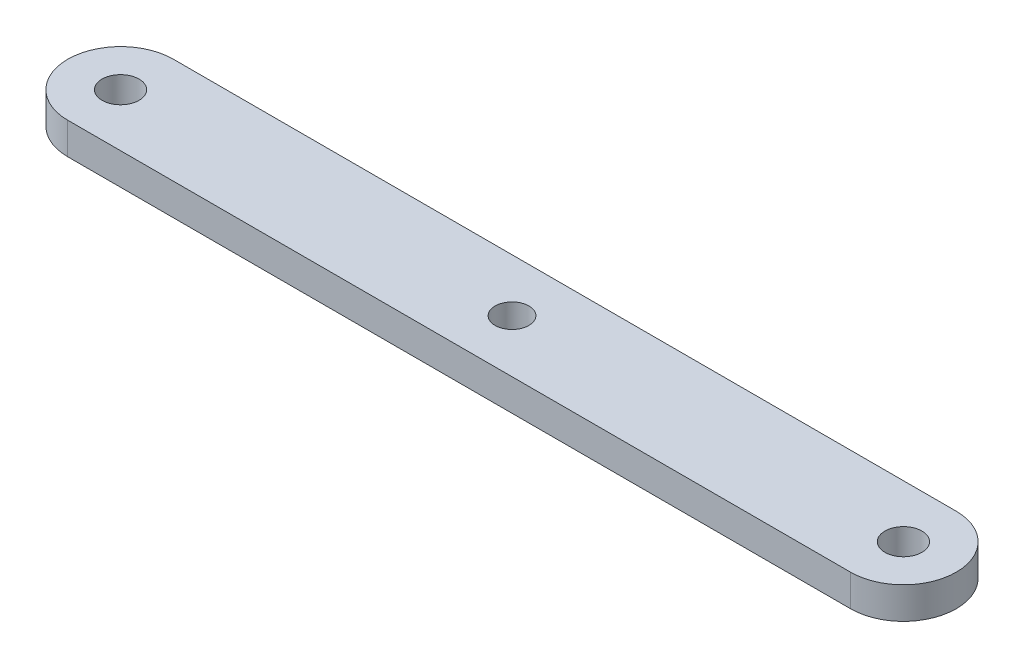
ISO-10303-21;
HEADER;
FILE_DESCRIPTION(('STEP AP214'),'2;1');
FILE_NAME('part.step','',(''),(''),'','','');
FILE_SCHEMA(('AUTOMOTIVE_DESIGN { 1 0 10303 214 1 1 1 1 }'));
ENDSEC;
DATA;
#1=APPLICATION_CONTEXT('core data for automotive mechanical design processes');
#2=APPLICATION_PROTOCOL_DEFINITION('international standard','automotive_design',2000,#1);
#3=PRODUCT_CONTEXT('',#1,'mechanical');
#4=PRODUCT('Part','Part','',(#3));
#5=PRODUCT_RELATED_PRODUCT_CATEGORY('part','',(#4));
#6=PRODUCT_DEFINITION_FORMATION('','',#4);
#7=PRODUCT_DEFINITION_CONTEXT('part definition',#1,'design');
#8=PRODUCT_DEFINITION('design','',#6,#7);
#9=PRODUCT_DEFINITION_SHAPE('','',#8);
#10=(LENGTH_UNIT() NAMED_UNIT(*) SI_UNIT(.MILLI.,.METRE.));
#11=(NAMED_UNIT(*) PLANE_ANGLE_UNIT() SI_UNIT($,.RADIAN.));
#12=(NAMED_UNIT(*) SI_UNIT($,.STERADIAN.) SOLID_ANGLE_UNIT());
#13=UNCERTAINTY_MEASURE_WITH_UNIT(LENGTH_MEASURE(1.E-05),#10,'distance_accuracy_value','');
#14=(GEOMETRIC_REPRESENTATION_CONTEXT(3) GLOBAL_UNCERTAINTY_ASSIGNED_CONTEXT((#13)) GLOBAL_UNIT_ASSIGNED_CONTEXT((#10,
#11,#12)) REPRESENTATION_CONTEXT('',''));
#15=CARTESIAN_POINT('',(0.,0.,0.));
#16=DIRECTION('',(0.,0.,1.));
#17=DIRECTION('',(1.,0.,0.));
#18=AXIS2_PLACEMENT_3D('',#15,#16,#17);
#19=CARTESIAN_POINT('',(-37.0517168291649,3.,25.));
#20=DIRECTION('',(0.,1.,0.));
#21=DIRECTION('',(0.,0.,1.));
#22=AXIS2_PLACEMENT_3D('',#19,#20,#21);
#23=PLANE('',#22);
#24=CARTESIAN_POINT('',(37.0517168291649,3.,25.));
#25=DIRECTION('',(0.,1.,0.));
#26=DIRECTION('',(0.,0.,1.));
#27=AXIS2_PLACEMENT_3D('',#24,#25,#26);
#28=CIRCLE('',#27,1.75);
#29=CARTESIAN_POINT('',(37.0517168291649,3.,26.75));
#30=VERTEX_POINT('',#29);
#31=EDGE_CURVE('E119',#30,#30,#28,.T.);
#32=ORIENTED_EDGE('',*,*,#31,.F.);
#33=EDGE_LOOP('',(#32));
#34=FACE_BOUND('',#33,.T.);
#35=CARTESIAN_POINT('',(-37.0517168291649,3.,25.));
#36=DIRECTION('',(0.,1.,0.));
#37=DIRECTION('',(0.,0.,1.));
#38=AXIS2_PLACEMENT_3D('',#35,#36,#37);
#39=CIRCLE('',#38,5.00000000000003);
#40=CARTESIAN_POINT('',(-37.0517168291649,3.,20.));
#41=VERTEX_POINT('',#40);
#42=CARTESIAN_POINT('',(-37.0517168291649,3.,30.));
#43=VERTEX_POINT('',#42);
#44=EDGE_CURVE('E89',#41,#43,#39,.T.);
#45=ORIENTED_EDGE('',*,*,#44,.T.);
#46=DIRECTION('',(1.,0.,0.));
#47=VECTOR('',#46,1.);
#48=CARTESIAN_POINT('',(-37.0517168291649,3.,30.));
#49=LINE('',#48,#47);
#50=CARTESIAN_POINT('',(37.0517168291649,3.,30.));
#51=VERTEX_POINT('',#50);
#52=EDGE_CURVE('E84',#43,#51,#49,.T.);
#53=ORIENTED_EDGE('',*,*,#52,.T.);
#54=CARTESIAN_POINT('',(37.0517168291649,3.,25.));
#55=DIRECTION('',(0.,1.,0.));
#56=DIRECTION('',(0.,0.,1.));
#57=AXIS2_PLACEMENT_3D('',#54,#55,#56);
#58=CIRCLE('',#57,5.00000000000003);
#59=CARTESIAN_POINT('',(37.0517168291649,3.,20.));
#60=VERTEX_POINT('',#59);
#61=EDGE_CURVE('E87',#51,#60,#58,.T.);
#62=ORIENTED_EDGE('',*,*,#61,.T.);
#63=DIRECTION('',(-1.,0.,0.));
#64=VECTOR('',#63,1.);
#65=CARTESIAN_POINT('',(-37.0517168291649,3.,20.));
#66=LINE('',#65,#64);
#67=EDGE_CURVE('E54',#60,#41,#66,.T.);
#68=ORIENTED_EDGE('',*,*,#67,.T.);
#69=EDGE_LOOP('',(#45,#53,#62,#68));
#70=FACE_BOUND('',#69,.T.);
#71=CARTESIAN_POINT('',(0.,3.,25.));
#72=DIRECTION('',(0.,1.,0.));
#73=DIRECTION('',(0.,0.,1.));
#74=AXIS2_PLACEMENT_3D('',#71,#72,#73);
#75=CIRCLE('',#74,1.6);
#76=CARTESIAN_POINT('',(0.,3.,26.6));
#77=VERTEX_POINT('',#76);
#78=EDGE_CURVE('E104',#77,#77,#75,.T.);
#79=ORIENTED_EDGE('',*,*,#78,.F.);
#80=EDGE_LOOP('',(#79));
#81=FACE_BOUND('',#80,.T.);
#82=CARTESIAN_POINT('',(-37.0517168291649,3.,25.));
#83=DIRECTION('',(0.,1.,0.));
#84=DIRECTION('',(0.,0.,-1.));
#85=AXIS2_PLACEMENT_3D('',#82,#83,#84);
#86=CIRCLE('',#85,1.75);
#87=CARTESIAN_POINT('',(-37.0517168291649,3.,23.25));
#88=VERTEX_POINT('',#87);
#89=EDGE_CURVE('E125',#88,#88,#86,.T.);
#90=ORIENTED_EDGE('',*,*,#89,.F.);
#91=EDGE_LOOP('',(#90));
#92=FACE_BOUND('',#91,.T.);
#93=ADVANCED_FACE('F37',(#34,#70,#81,#92),#23,.T.);
#94=CARTESIAN_POINT('',(-37.0517168291649,0.,25.));
#95=DIRECTION('',(0.,1.,0.));
#96=DIRECTION('',(0.,0.,1.));
#97=AXIS2_PLACEMENT_3D('',#94,#95,#96);
#98=PLANE('',#97);
#99=CARTESIAN_POINT('',(-37.0517168291649,0.,25.));
#100=DIRECTION('',(0.,1.,0.));
#101=DIRECTION('',(0.,0.,1.));
#102=AXIS2_PLACEMENT_3D('',#99,#100,#101);
#103=CIRCLE('',#102,5.00000000000003);
#104=CARTESIAN_POINT('',(-37.0517168291649,0.,20.));
#105=VERTEX_POINT('',#104);
#106=CARTESIAN_POINT('',(-37.0517168291649,0.,30.));
#107=VERTEX_POINT('',#106);
#108=EDGE_CURVE('E101',#105,#107,#103,.T.);
#109=ORIENTED_EDGE('',*,*,#108,.F.);
#110=DIRECTION('',(-1.,0.,0.));
#111=VECTOR('',#110,1.);
#112=CARTESIAN_POINT('',(-37.0517168291649,0.,20.));
#113=LINE('',#112,#111);
#114=CARTESIAN_POINT('',(37.0517168291649,0.,20.));
#115=VERTEX_POINT('',#114);
#116=EDGE_CURVE('E77',#115,#105,#113,.T.);
#117=ORIENTED_EDGE('',*,*,#116,.F.);
#118=CARTESIAN_POINT('',(37.0517168291649,0.,25.));
#119=DIRECTION('',(0.,1.,0.));
#120=DIRECTION('',(0.,0.,1.));
#121=AXIS2_PLACEMENT_3D('',#118,#119,#120);
#122=CIRCLE('',#121,5.00000000000003);
#123=CARTESIAN_POINT('',(37.0517168291649,0.,30.));
#124=VERTEX_POINT('',#123);
#125=EDGE_CURVE('E71',#124,#115,#122,.T.);
#126=ORIENTED_EDGE('',*,*,#125,.F.);
#127=DIRECTION('',(1.,0.,0.));
#128=VECTOR('',#127,1.);
#129=CARTESIAN_POINT('',(-37.0517168291649,0.,30.));
#130=LINE('',#129,#128);
#131=EDGE_CURVE('E93',#107,#124,#130,.T.);
#132=ORIENTED_EDGE('',*,*,#131,.F.);
#133=EDGE_LOOP('',(#109,#117,#126,#132));
#134=FACE_BOUND('',#133,.T.);
#135=CARTESIAN_POINT('',(0.,0.,25.));
#136=DIRECTION('',(0.,1.,0.));
#137=DIRECTION('',(0.,0.,1.));
#138=AXIS2_PLACEMENT_3D('',#135,#136,#137);
#139=CIRCLE('',#138,1.6);
#140=CARTESIAN_POINT('',(0.,0.,26.6));
#141=VERTEX_POINT('',#140);
#142=EDGE_CURVE('E116',#141,#141,#139,.T.);
#143=ORIENTED_EDGE('',*,*,#142,.T.);
#144=EDGE_LOOP('',(#143));
#145=FACE_BOUND('',#144,.T.);
#146=CARTESIAN_POINT('',(37.0517168291649,0.,25.));
#147=DIRECTION('',(0.,1.,0.));
#148=DIRECTION('',(0.,0.,1.));
#149=AXIS2_PLACEMENT_3D('',#146,#147,#148);
#150=CIRCLE('',#149,1.75);
#151=CARTESIAN_POINT('',(37.0517168291649,0.,26.75));
#152=VERTEX_POINT('',#151);
#153=EDGE_CURVE('E122',#152,#152,#150,.T.);
#154=ORIENTED_EDGE('',*,*,#153,.T.);
#155=EDGE_LOOP('',(#154));
#156=FACE_BOUND('',#155,.T.);
#157=CARTESIAN_POINT('',(-37.0517168291649,0.,25.));
#158=DIRECTION('',(0.,1.,0.));
#159=DIRECTION('',(0.,0.,-1.));
#160=AXIS2_PLACEMENT_3D('',#157,#158,#159);
#161=CIRCLE('',#160,1.75);
#162=CARTESIAN_POINT('',(-37.0517168291649,0.,23.25));
#163=VERTEX_POINT('',#162);
#164=EDGE_CURVE('E128',#163,#163,#161,.T.);
#165=ORIENTED_EDGE('',*,*,#164,.T.);
#166=EDGE_LOOP('',(#165));
#167=FACE_BOUND('',#166,.T.);
#168=ADVANCED_FACE('F112',(#134,#145,#156,#167),#98,.F.);
#169=CARTESIAN_POINT('',(-37.0517168291649,3.,25.));
#170=DIRECTION('',(0.,-1.,0.));
#171=DIRECTION('',(0.,0.,-1.));
#172=AXIS2_PLACEMENT_3D('',#169,#170,#171);
#173=CYLINDRICAL_SURFACE('',#172,5.00000000000003);
#174=ORIENTED_EDGE('',*,*,#108,.T.);
#175=DIRECTION('',(0.,-1.,0.));
#176=VECTOR('',#175,1.);
#177=CARTESIAN_POINT('',(-37.0517168291649,3.,30.));
#178=LINE('',#177,#176);
#179=EDGE_CURVE('E11',#43,#107,#178,.T.);
#180=ORIENTED_EDGE('',*,*,#179,.F.);
#181=ORIENTED_EDGE('',*,*,#44,.F.);
#182=DIRECTION('',(0.,-1.,0.));
#183=VECTOR('',#182,1.);
#184=CARTESIAN_POINT('',(-37.0517168291649,3.,20.));
#185=LINE('',#184,#183);
#186=EDGE_CURVE('E97',#41,#105,#185,.T.);
#187=ORIENTED_EDGE('',*,*,#186,.T.);
#188=EDGE_LOOP('',(#174,#180,#181,#187));
#189=FACE_BOUND('',#188,.T.);
#190=ADVANCED_FACE('F39',(#189),#173,.T.);
#191=CARTESIAN_POINT('',(-37.0517168291649,3.,30.));
#192=DIRECTION('',(0.,0.,-1.));
#193=DIRECTION('',(-1.,0.,0.));
#194=AXIS2_PLACEMENT_3D('',#191,#192,#193);
#195=PLANE('',#194);
#196=ORIENTED_EDGE('',*,*,#131,.T.);
#197=DIRECTION('',(0.,-1.,0.));
#198=VECTOR('',#197,1.);
#199=CARTESIAN_POINT('',(37.0517168291649,3.,30.));
#200=LINE('',#199,#198);
#201=EDGE_CURVE('E46',#51,#124,#200,.T.);
#202=ORIENTED_EDGE('',*,*,#201,.F.);
#203=ORIENTED_EDGE('',*,*,#52,.F.);
#204=ORIENTED_EDGE('',*,*,#179,.T.);
#205=EDGE_LOOP('',(#196,#202,#203,#204));
#206=FACE_BOUND('',#205,.T.);
#207=ADVANCED_FACE('F92',(#206),#195,.F.);
#208=CARTESIAN_POINT('',(37.0517168291649,3.,25.));
#209=DIRECTION('',(0.,-1.,0.));
#210=DIRECTION('',(0.,0.,-1.));
#211=AXIS2_PLACEMENT_3D('',#208,#209,#210);
#212=CYLINDRICAL_SURFACE('',#211,5.00000000000003);
#213=ORIENTED_EDGE('',*,*,#125,.T.);
#214=DIRECTION('',(0.,-1.,0.));
#215=VECTOR('',#214,1.);
#216=CARTESIAN_POINT('',(37.0517168291649,3.,20.));
#217=LINE('',#216,#215);
#218=EDGE_CURVE('E94',#60,#115,#217,.T.);
#219=ORIENTED_EDGE('',*,*,#218,.F.);
#220=ORIENTED_EDGE('',*,*,#61,.F.);
#221=ORIENTED_EDGE('',*,*,#201,.T.);
#222=EDGE_LOOP('',(#213,#219,#220,#221));
#223=FACE_BOUND('',#222,.T.);
#224=ADVANCED_FACE('F95',(#223),#212,.T.);
#225=CARTESIAN_POINT('',(-37.0517168291649,3.,20.));
#226=DIRECTION('',(0.,0.,1.));
#227=DIRECTION('',(1.,0.,0.));
#228=AXIS2_PLACEMENT_3D('',#225,#226,#227);
#229=PLANE('',#228);
#230=ORIENTED_EDGE('',*,*,#116,.T.);
#231=ORIENTED_EDGE('',*,*,#186,.F.);
#232=ORIENTED_EDGE('',*,*,#67,.F.);
#233=ORIENTED_EDGE('',*,*,#218,.T.);
#234=EDGE_LOOP('',(#230,#231,#232,#233));
#235=FACE_BOUND('',#234,.T.);
#236=ADVANCED_FACE('F109',(#235),#229,.F.);
#237=CARTESIAN_POINT('',(0.,3.,25.));
#238=DIRECTION('',(0.,-1.,0.));
#239=DIRECTION('',(0.,0.,-1.));
#240=AXIS2_PLACEMENT_3D('',#237,#238,#239);
#241=CYLINDRICAL_SURFACE('',#240,1.6);
#242=ORIENTED_EDGE('',*,*,#78,.T.);
#243=EDGE_LOOP('',(#242));
#244=FACE_BOUND('',#243,.T.);
#245=ORIENTED_EDGE('',*,*,#142,.F.);
#246=EDGE_LOOP('',(#245));
#247=FACE_BOUND('',#246,.T.);
#248=ADVANCED_FACE('F146',(#244,#247),#241,.F.);
#249=CARTESIAN_POINT('',(37.0517168291649,3.,25.));
#250=DIRECTION('',(0.,-1.,0.));
#251=DIRECTION('',(0.,0.,-1.));
#252=AXIS2_PLACEMENT_3D('',#249,#250,#251);
#253=CYLINDRICAL_SURFACE('',#252,1.75);
#254=ORIENTED_EDGE('',*,*,#31,.T.);
#255=EDGE_LOOP('',(#254));
#256=FACE_BOUND('',#255,.T.);
#257=ORIENTED_EDGE('',*,*,#153,.F.);
#258=EDGE_LOOP('',(#257));
#259=FACE_BOUND('',#258,.T.);
#260=ADVANCED_FACE('F192',(#256,#259),#253,.F.);
#261=CARTESIAN_POINT('',(-37.0517168291649,3.,25.));
#262=DIRECTION('',(0.,-1.,0.));
#263=DIRECTION('',(0.,0.,-1.));
#264=AXIS2_PLACEMENT_3D('',#261,#262,#263);
#265=CYLINDRICAL_SURFACE('',#264,1.75);
#266=ORIENTED_EDGE('',*,*,#89,.T.);
#267=EDGE_LOOP('',(#266));
#268=FACE_BOUND('',#267,.T.);
#269=ORIENTED_EDGE('',*,*,#164,.F.);
#270=EDGE_LOOP('',(#269));
#271=FACE_BOUND('',#270,.T.);
#272=ADVANCED_FACE('F134',(#268,#271),#265,.F.);
#273=CLOSED_SHELL('',(#93,#168,#190,#207,#224,#236,#248,#260,#272));
#274=MANIFOLD_SOLID_BREP('B2',#273);
#275=ADVANCED_BREP_SHAPE_REPRESENTATION('',(#18,#274),#14);
#276=SHAPE_DEFINITION_REPRESENTATION(#9,#275);
ENDSEC;
END-ISO-10303-21;
